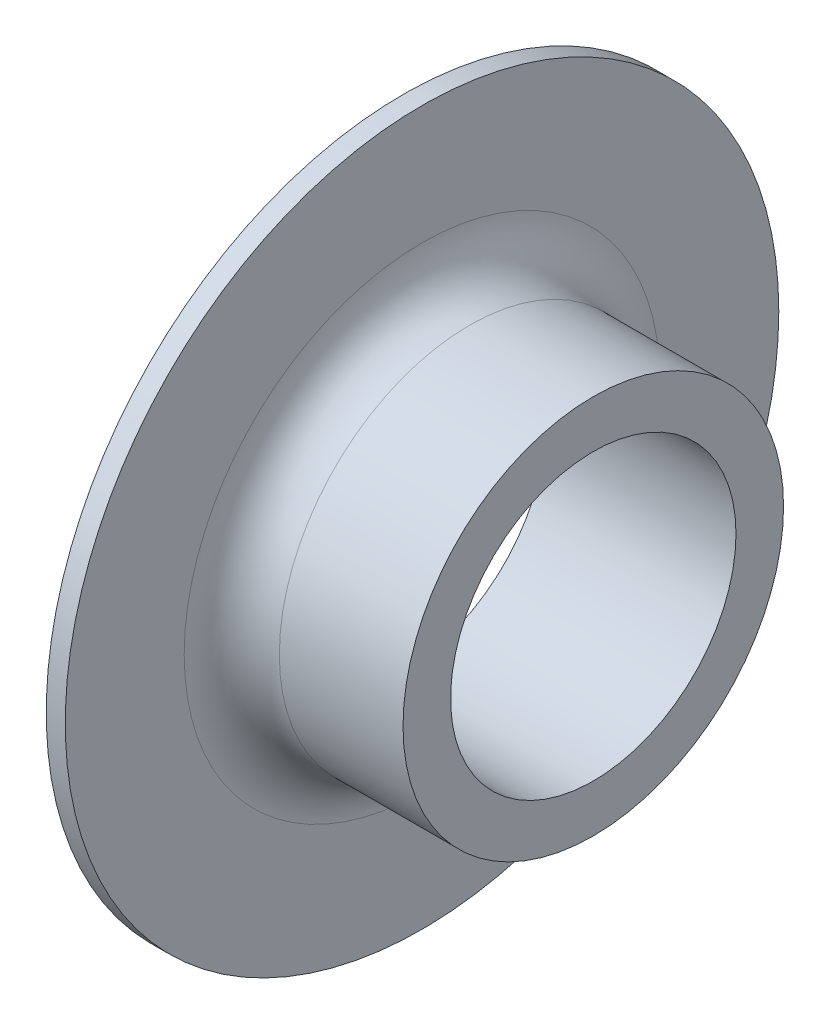
ISO-10303-21;
HEADER;
FILE_DESCRIPTION(('STEP AP214'),'2;1');
FILE_NAME('part.step','',(''),(''),'','','');
FILE_SCHEMA(('AUTOMOTIVE_DESIGN { 1 0 10303 214 1 1 1 1 }'));
ENDSEC;
DATA;
#1=APPLICATION_CONTEXT('core data for automotive mechanical design processes');
#2=APPLICATION_PROTOCOL_DEFINITION('international standard','automotive_design',2000,#1);
#3=PRODUCT_CONTEXT('',#1,'mechanical');
#4=PRODUCT('Part','Part','',(#3));
#5=PRODUCT_RELATED_PRODUCT_CATEGORY('part','',(#4));
#6=PRODUCT_DEFINITION_FORMATION('','',#4);
#7=PRODUCT_DEFINITION_CONTEXT('part definition',#1,'design');
#8=PRODUCT_DEFINITION('design','',#6,#7);
#9=PRODUCT_DEFINITION_SHAPE('','',#8);
#10=(LENGTH_UNIT() NAMED_UNIT(*) SI_UNIT(.MILLI.,.METRE.));
#11=(NAMED_UNIT(*) PLANE_ANGLE_UNIT() SI_UNIT($,.RADIAN.));
#12=(NAMED_UNIT(*) SI_UNIT($,.STERADIAN.) SOLID_ANGLE_UNIT());
#13=UNCERTAINTY_MEASURE_WITH_UNIT(LENGTH_MEASURE(1.E-05),#10,'distance_accuracy_value','');
#14=(GEOMETRIC_REPRESENTATION_CONTEXT(3) GLOBAL_UNCERTAINTY_ASSIGNED_CONTEXT((#13)) GLOBAL_UNIT_ASSIGNED_CONTEXT((#10,
#11,#12)) REPRESENTATION_CONTEXT('',''));
#15=CARTESIAN_POINT('',(0.,0.,0.));
#16=DIRECTION('',(0.,0.,1.));
#17=DIRECTION('',(1.,0.,0.));
#18=AXIS2_PLACEMENT_3D('',#15,#16,#17);
#19=CARTESIAN_POINT('',(13.9591260526521,15.,0.));
#20=DIRECTION('',(-1.,0.,0.));
#21=DIRECTION('',(0.,0.,1.));
#22=AXIS2_PLACEMENT_3D('',#19,#20,#21);
#23=PLANE('',#22);
#24=CARTESIAN_POINT('',(13.9591260526521,0.,0.));
#25=DIRECTION('',(1.,0.,0.));
#26=DIRECTION('',(0.,0.,-1.));
#27=AXIS2_PLACEMENT_3D('',#24,#25,#26);
#28=CIRCLE('',#27,15.);
#29=CARTESIAN_POINT('',(13.9591260526521,0.,-15.));
#30=VERTEX_POINT('',#29);
#31=EDGE_CURVE('E69',#30,#30,#28,.T.);
#32=ORIENTED_EDGE('',*,*,#31,.T.);
#33=EDGE_LOOP('',(#32));
#34=FACE_BOUND('',#33,.T.);
#35=CARTESIAN_POINT('',(13.9591260526521,0.,0.));
#36=DIRECTION('',(1.,0.,0.));
#37=DIRECTION('',(0.,0.,-1.));
#38=AXIS2_PLACEMENT_3D('',#35,#36,#37);
#39=CIRCLE('',#38,37.5);
#40=CARTESIAN_POINT('',(13.9591260526521,0.,-37.5));
#41=VERTEX_POINT('',#40);
#42=EDGE_CURVE('E50',#41,#41,#39,.T.);
#43=ORIENTED_EDGE('',*,*,#42,.F.);
#44=EDGE_LOOP('',(#43));
#45=FACE_BOUND('',#44,.T.);
#46=ADVANCED_FACE('F37',(#34,#45),#23,.T.);
#47=CARTESIAN_POINT('',(66.865858879555,0.,0.));
#48=DIRECTION('',(1.,0.,0.));
#49=DIRECTION('',(0.,0.,-1.));
#50=AXIS2_PLACEMENT_3D('',#47,#48,#49);
#51=CYLINDRICAL_SURFACE('',#50,37.5);
#52=ORIENTED_EDGE('',*,*,#42,.T.);
#53=EDGE_LOOP('',(#52));
#54=FACE_BOUND('',#53,.T.);
#55=CARTESIAN_POINT('',(15.9591260526521,0.,0.));
#56=DIRECTION('',(1.,0.,0.));
#57=DIRECTION('',(0.,0.,-1.));
#58=AXIS2_PLACEMENT_3D('',#55,#56,#57);
#59=CIRCLE('',#58,37.5);
#60=CARTESIAN_POINT('',(15.9591260526521,0.,-37.5));
#61=VERTEX_POINT('',#60);
#62=EDGE_CURVE('E55',#61,#61,#59,.T.);
#63=ORIENTED_EDGE('',*,*,#62,.F.);
#64=EDGE_LOOP('',(#63));
#65=FACE_BOUND('',#64,.T.);
#66=ADVANCED_FACE('F90',(#54,#65),#51,.T.);
#67=CARTESIAN_POINT('',(15.9591260526521,37.5,0.));
#68=DIRECTION('',(1.,0.,0.));
#69=DIRECTION('',(0.,0.,-1.));
#70=AXIS2_PLACEMENT_3D('',#67,#68,#69);
#71=PLANE('',#70);
#72=CARTESIAN_POINT('',(15.9591260526521,0.,0.));
#73=DIRECTION('',(1.,0.,0.));
#74=DIRECTION('',(0.,0.,-1.));
#75=AXIS2_PLACEMENT_3D('',#72,#73,#74);
#76=CIRCLE('',#75,25.);
#77=CARTESIAN_POINT('',(15.9591260526521,0.,-25.));
#78=VERTEX_POINT('',#77);
#79=EDGE_CURVE('E10',#78,#78,#76,.F.);
#80=ORIENTED_EDGE('',*,*,#79,.T.);
#81=EDGE_LOOP('',(#80));
#82=FACE_BOUND('',#81,.T.);
#83=ORIENTED_EDGE('',*,*,#62,.T.);
#84=EDGE_LOOP('',(#83));
#85=FACE_BOUND('',#84,.T.);
#86=ADVANCED_FACE('F94',(#82,#85),#71,.T.);
#87=CARTESIAN_POINT('',(66.865858879555,0.,0.));
#88=DIRECTION('',(1.,0.,0.));
#89=DIRECTION('',(0.,0.,-1.));
#90=AXIS2_PLACEMENT_3D('',#87,#88,#89);
#91=CYLINDRICAL_SURFACE('',#90,20.);
#92=CARTESIAN_POINT('',(20.9591260526521,0.,0.));
#93=DIRECTION('',(1.,0.,0.));
#94=DIRECTION('',(0.,0.,-1.));
#95=AXIS2_PLACEMENT_3D('',#92,#93,#94);
#96=CIRCLE('',#95,20.);
#97=CARTESIAN_POINT('',(20.9591260526521,0.,-20.));
#98=VERTEX_POINT('',#97);
#99=EDGE_CURVE('E45',#98,#98,#96,.T.);
#100=ORIENTED_EDGE('',*,*,#99,.T.);
#101=EDGE_LOOP('',(#100));
#102=FACE_BOUND('',#101,.T.);
#103=CARTESIAN_POINT('',(33.9591260526521,0.,0.));
#104=DIRECTION('',(1.,0.,0.));
#105=DIRECTION('',(0.,0.,-1.));
#106=AXIS2_PLACEMENT_3D('',#103,#104,#105);
#107=CIRCLE('',#106,20.);
#108=CARTESIAN_POINT('',(33.9591260526521,0.,-20.));
#109=VERTEX_POINT('',#108);
#110=EDGE_CURVE('E61',#109,#109,#107,.T.);
#111=ORIENTED_EDGE('',*,*,#110,.F.);
#112=EDGE_LOOP('',(#111));
#113=FACE_BOUND('',#112,.T.);
#114=ADVANCED_FACE('F86',(#102,#113),#91,.T.);
#115=CARTESIAN_POINT('',(33.9591260526521,20.,0.));
#116=DIRECTION('',(1.,0.,0.));
#117=DIRECTION('',(0.,0.,-1.));
#118=AXIS2_PLACEMENT_3D('',#115,#116,#117);
#119=PLANE('',#118);
#120=ORIENTED_EDGE('',*,*,#110,.T.);
#121=EDGE_LOOP('',(#120));
#122=FACE_BOUND('',#121,.T.);
#123=CARTESIAN_POINT('',(33.9591260526521,0.,0.));
#124=DIRECTION('',(1.,0.,0.));
#125=DIRECTION('',(0.,0.,-1.));
#126=AXIS2_PLACEMENT_3D('',#123,#124,#125);
#127=CIRCLE('',#126,15.);
#128=CARTESIAN_POINT('',(33.9591260526521,0.,-15.));
#129=VERTEX_POINT('',#128);
#130=EDGE_CURVE('E65',#129,#129,#127,.T.);
#131=ORIENTED_EDGE('',*,*,#130,.F.);
#132=EDGE_LOOP('',(#131));
#133=FACE_BOUND('',#132,.T.);
#134=ADVANCED_FACE('F78',(#122,#133),#119,.T.);
#135=CARTESIAN_POINT('',(66.865858879555,0.,0.));
#136=DIRECTION('',(1.,0.,0.));
#137=DIRECTION('',(0.,0.,-1.));
#138=AXIS2_PLACEMENT_3D('',#135,#136,#137);
#139=CYLINDRICAL_SURFACE('',#138,15.);
#140=ORIENTED_EDGE('',*,*,#130,.T.);
#141=EDGE_LOOP('',(#140));
#142=FACE_BOUND('',#141,.T.);
#143=ORIENTED_EDGE('',*,*,#31,.F.);
#144=EDGE_LOOP('',(#143));
#145=FACE_BOUND('',#144,.T.);
#146=ADVANCED_FACE('F76',(#142,#145),#139,.F.);
#147=CARTESIAN_POINT('',(20.9591260526521,0.,0.));
#148=DIRECTION('',(1.,0.,0.));
#149=DIRECTION('',(0.,0.,-1.));
#150=AXIS2_PLACEMENT_3D('',#147,#148,#149);
#151=TOROIDAL_SURFACE('',#150,25.,5.);
#152=ORIENTED_EDGE('',*,*,#79,.F.);
#153=EDGE_LOOP('',(#152));
#154=FACE_BOUND('',#153,.T.);
#155=ORIENTED_EDGE('',*,*,#99,.F.);
#156=EDGE_LOOP('',(#155));
#157=FACE_BOUND('',#156,.T.);
#158=ADVANCED_FACE('F39',(#154,#157),#151,.F.);
#159=CLOSED_SHELL('',(#46,#66,#86,#114,#134,#146,#158));
#160=MANIFOLD_SOLID_BREP('B2',#159);
#161=ADVANCED_BREP_SHAPE_REPRESENTATION('',(#18,#160),#14);
#162=SHAPE_DEFINITION_REPRESENTATION(#9,#161);
ENDSEC;
END-ISO-10303-21;
